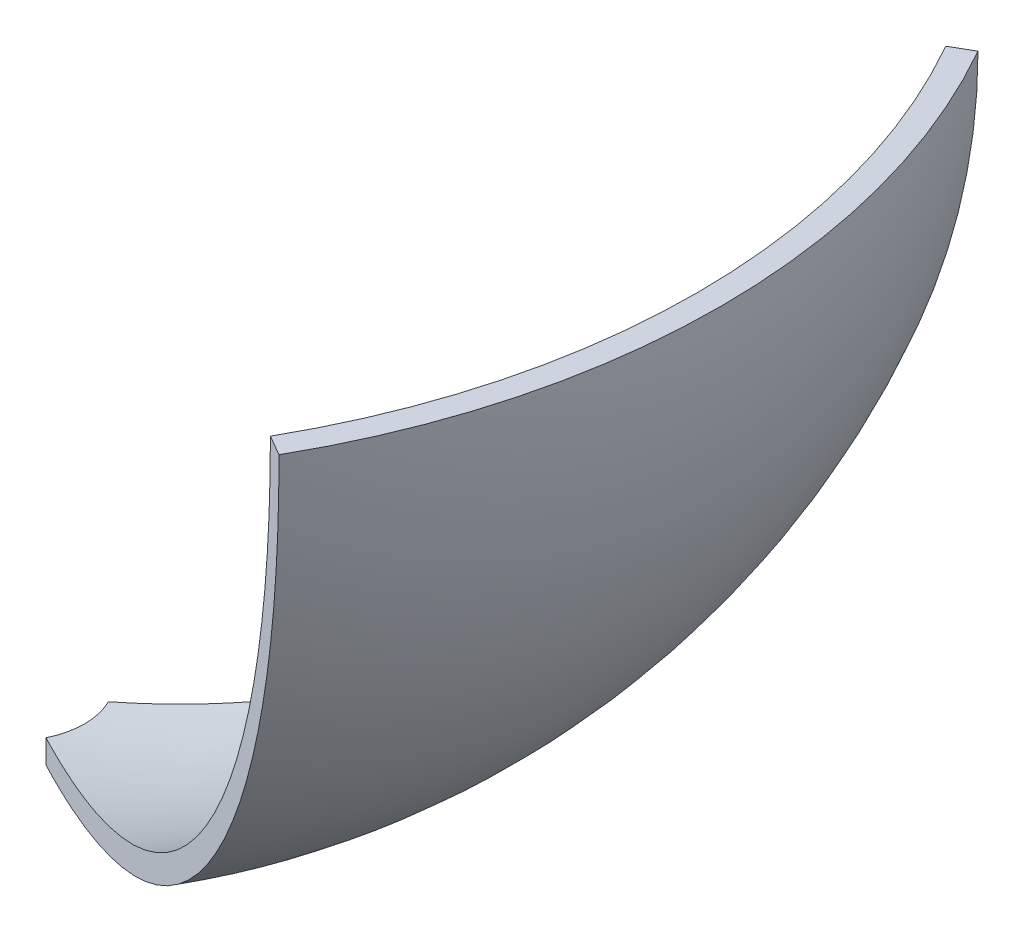
ISO-10303-21;
HEADER;
FILE_DESCRIPTION(('STEP AP214'),'2;1');
FILE_NAME('part.step','',(''),(''),'','','');
FILE_SCHEMA(('AUTOMOTIVE_DESIGN { 1 0 10303 214 1 1 1 1 }'));
ENDSEC;
DATA;
#1=APPLICATION_CONTEXT('core data for automotive mechanical design processes');
#2=APPLICATION_PROTOCOL_DEFINITION('international standard','automotive_design',2000,#1);
#3=PRODUCT_CONTEXT('',#1,'mechanical');
#4=PRODUCT('Part','Part','',(#3));
#5=PRODUCT_RELATED_PRODUCT_CATEGORY('part','',(#4));
#6=PRODUCT_DEFINITION_FORMATION('','',#4);
#7=PRODUCT_DEFINITION_CONTEXT('part definition',#1,'design');
#8=PRODUCT_DEFINITION('design','',#6,#7);
#9=PRODUCT_DEFINITION_SHAPE('','',#8);
#10=(LENGTH_UNIT() NAMED_UNIT(*) SI_UNIT(.MILLI.,.METRE.));
#11=(NAMED_UNIT(*) PLANE_ANGLE_UNIT() SI_UNIT($,.RADIAN.));
#12=(NAMED_UNIT(*) SI_UNIT($,.STERADIAN.) SOLID_ANGLE_UNIT());
#13=UNCERTAINTY_MEASURE_WITH_UNIT(LENGTH_MEASURE(1.E-05),#10,'distance_accuracy_value','');
#14=(GEOMETRIC_REPRESENTATION_CONTEXT(3) GLOBAL_UNCERTAINTY_ASSIGNED_CONTEXT((#13)) GLOBAL_UNIT_ASSIGNED_CONTEXT((#10,
#11,#12)) REPRESENTATION_CONTEXT('',''));
#15=CARTESIAN_POINT('',(0.,0.,0.));
#16=DIRECTION('',(0.,0.,1.));
#17=DIRECTION('',(1.,0.,0.));
#18=AXIS2_PLACEMENT_3D('',#15,#16,#17);
#19=CARTESIAN_POINT('',(0.,150.,0.));
#20=DIRECTION('',(0.,-1.,0.));
#21=DIRECTION('',(-0.866025403784438,0.,0.500000000000001));
#22=AXIS2_PLACEMENT_3D('',#19,#20,#21);
#23=SPHERICAL_SURFACE('',#22,150.);
#24=CARTESIAN_POINT('',(0.,150.,0.));
#25=DIRECTION('',(0.,-1.,0.));
#26=DIRECTION('',(1.,0.,0.));
#27=AXIS2_PLACEMENT_3D('',#24,#25,#26);
#28=CIRCLE('',#27,150.);
#29=CARTESIAN_POINT('',(130.400923784203,150.,-74.1323079111025));
#30=VERTEX_POINT('',#29);
#31=CARTESIAN_POINT('',(130.400923784244,150.,74.1323079110296));
#32=VERTEX_POINT('',#31);
#33=EDGE_CURVE('E187',#30,#32,#28,.T.);
#34=ORIENTED_EDGE('',*,*,#33,.T.);
#35=CARTESIAN_POINT('',(0.499999999999992,150.,-0.866025403784478));
#36=DIRECTION('',(-0.499999999999998,0.,0.86602540378444));
#37=DIRECTION('',(0.86602540378444,0.,0.499999999999998));
#38=AXIS2_PLACEMENT_3D('',#35,#36,#37);
#39=CIRCLE('',#38,149.996666629629);
#40=CARTESIAN_POINT('',(13.4614813968158,0.751884434007007,6.61728936976337));
#41=VERTEX_POINT('',#40);
#42=EDGE_CURVE('E200',#32,#41,#39,.F.);
#43=ORIENTED_EDGE('',*,*,#42,.T.);
#44=CARTESIAN_POINT('',(0.,0.751884434007033,0.));
#45=DIRECTION('',(0.,1.,0.));
#46=DIRECTION('',(0.,0.,1.));
#47=AXIS2_PLACEMENT_3D('',#44,#45,#46);
#48=CIRCLE('',#47,15.);
#49=CARTESIAN_POINT('',(13.461481396794,0.751884434007033,-6.6172893698077));
#50=VERTEX_POINT('',#49);
#51=EDGE_CURVE('E189',#41,#50,#48,.T.);
#52=ORIENTED_EDGE('',*,*,#51,.T.);
#53=CARTESIAN_POINT('',(0.499999999977488,150.,0.866025403744988));
#54=DIRECTION('',(-0.50000000000022,0.,-0.866025403784312));
#55=DIRECTION('',(-0.866025403784312,0.,0.50000000000022));
#56=AXIS2_PLACEMENT_3D('',#53,#54,#55);
#57=CIRCLE('',#56,149.996666629629);
#58=EDGE_CURVE('E157',#50,#30,#57,.F.);
#59=ORIENTED_EDGE('',*,*,#58,.T.);
#60=EDGE_LOOP('',(#34,#43,#52,#59));
#61=FACE_BOUND('',#60,.T.);
#62=ADVANCED_FACE('F135',(#61),#23,.T.);
#63=CARTESIAN_POINT('',(0.,150.,0.));
#64=DIRECTION('',(0.,-1.,0.));
#65=DIRECTION('',(0.866025403784438,0.,-0.500000000000001));
#66=AXIS2_PLACEMENT_3D('',#63,#64,#65);
#67=SPHERICAL_SURFACE('',#66,145.);
#68=CARTESIAN_POINT('',(0.,5.77794898144041,0.));
#69=DIRECTION('',(0.,1.,0.));
#70=DIRECTION('',(0.,0.,1.));
#71=AXIS2_PLACEMENT_3D('',#68,#69,#70);
#72=CIRCLE('',#71,15.);
#73=CARTESIAN_POINT('',(13.461481396794,5.77794898144041,-6.6172893698077));
#74=VERTEX_POINT('',#73);
#75=CARTESIAN_POINT('',(13.4614813968158,5.77794898144041,6.61728936976337));
#76=VERTEX_POINT('',#75);
#77=EDGE_CURVE('E197',#74,#76,#72,.F.);
#78=ORIENTED_EDGE('',*,*,#77,.T.);
#79=CARTESIAN_POINT('',(0.499999999999992,150.,-0.866025403784478));
#80=DIRECTION('',(-0.499999999999998,0.,0.86602540378444));
#81=DIRECTION('',(0.86602540378444,0.,0.499999999999998));
#82=AXIS2_PLACEMENT_3D('',#79,#80,#81);
#83=CIRCLE('',#82,144.996551683135);
#84=CARTESIAN_POINT('',(126.070697218738,150.,71.6322504377827));
#85=VERTEX_POINT('',#84);
#86=EDGE_CURVE('E150',#76,#85,#83,.T.);
#87=ORIENTED_EDGE('',*,*,#86,.T.);
#88=CARTESIAN_POINT('',(0.,150.,0.));
#89=DIRECTION('',(0.,-1.,0.));
#90=DIRECTION('',(1.,0.,0.));
#91=AXIS2_PLACEMENT_3D('',#88,#89,#90);
#92=CIRCLE('',#91,145.);
#93=CARTESIAN_POINT('',(126.070697218697,150.,-71.6322504378544));
#94=VERTEX_POINT('',#93);
#95=EDGE_CURVE('E192',#94,#85,#92,.T.);
#96=ORIENTED_EDGE('',*,*,#95,.F.);
#97=CARTESIAN_POINT('',(0.499999999977488,150.,0.866025403744988));
#98=DIRECTION('',(-0.50000000000022,0.,-0.866025403784312));
#99=DIRECTION('',(-0.866025403784312,0.,0.50000000000022));
#100=AXIS2_PLACEMENT_3D('',#97,#98,#99);
#101=CIRCLE('',#100,144.996551683135);
#102=EDGE_CURVE('E176',#94,#74,#101,.T.);
#103=ORIENTED_EDGE('',*,*,#102,.T.);
#104=EDGE_LOOP('',(#78,#87,#96,#103));
#105=FACE_BOUND('',#104,.T.);
#106=ADVANCED_FACE('F206',(#105),#67,.F.);
#107=CARTESIAN_POINT('',(125.573683548743,150.,-72.5000000000001));
#108=DIRECTION('',(0.,1.,0.));
#109=DIRECTION('',(-1.,0.,0.));
#110=AXIS2_PLACEMENT_3D('',#107,#108,#109);
#111=PLANE('',#110);
#112=ORIENTED_EDGE('',*,*,#95,.T.);
#113=DIRECTION('',(0.86602540378444,0.,0.499999999999998));
#114=VECTOR('',#113,1.);
#115=CARTESIAN_POINT('',(0.499999999999996,150.,-0.866025403784477));
#116=LINE('',#115,#114);
#117=EDGE_CURVE('E181',#85,#32,#116,.T.);
#118=ORIENTED_EDGE('',*,*,#117,.T.);
#119=ORIENTED_EDGE('',*,*,#33,.F.);
#120=DIRECTION('',(-0.866025403784312,0.,0.50000000000022));
#121=VECTOR('',#120,1.);
#122=CARTESIAN_POINT('',(154.533546158022,150.,-88.065283934887));
#123=LINE('',#122,#121);
#124=EDGE_CURVE('E173',#30,#94,#123,.T.);
#125=ORIENTED_EDGE('',*,*,#124,.T.);
#126=EDGE_LOOP('',(#112,#118,#119,#125));
#127=FACE_BOUND('',#126,.T.);
#128=ADVANCED_FACE('F137',(#127),#111,.T.);
#129=CARTESIAN_POINT('',(0.,9.,0.));
#130=DIRECTION('',(0.,-1.,0.));
#131=DIRECTION('',(0.,0.,-1.));
#132=AXIS2_PLACEMENT_3D('',#129,#130,#131);
#133=CYLINDRICAL_SURFACE('',#132,15.);
#134=ORIENTED_EDGE('',*,*,#51,.F.);
#135=DIRECTION('',(0.,-1.,0.));
#136=VECTOR('',#135,1.);
#137=CARTESIAN_POINT('',(13.4614813968158,9.,6.61728936976337));
#138=LINE('',#137,#136);
#139=EDGE_CURVE('E12',#41,#76,#138,.F.);
#140=ORIENTED_EDGE('',*,*,#139,.T.);
#141=ORIENTED_EDGE('',*,*,#77,.F.);
#142=DIRECTION('',(0.,-1.,0.));
#143=VECTOR('',#142,1.);
#144=CARTESIAN_POINT('',(13.461481396794,9.,-6.6172893698077));
#145=LINE('',#144,#143);
#146=EDGE_CURVE('E143',#74,#50,#145,.T.);
#147=ORIENTED_EDGE('',*,*,#146,.T.);
#148=EDGE_LOOP('',(#134,#140,#141,#147));
#149=FACE_BOUND('',#148,.T.);
#150=ADVANCED_FACE('F208',(#149),#133,.F.);
#151=CARTESIAN_POINT('',(154.533546158023,0.751884434007033,-88.065283934887));
#152=DIRECTION('',(-0.50000000000022,0.,-0.866025403784312));
#153=DIRECTION('',(-0.866025403784312,0.,0.50000000000022));
#154=AXIS2_PLACEMENT_3D('',#151,#152,#153);
#155=PLANE('',#154);
#156=ORIENTED_EDGE('',*,*,#146,.F.);
#157=ORIENTED_EDGE('',*,*,#102,.F.);
#158=ORIENTED_EDGE('',*,*,#124,.F.);
#159=ORIENTED_EDGE('',*,*,#58,.F.);
#160=EDGE_LOOP('',(#156,#157,#158,#159));
#161=FACE_BOUND('',#160,.T.);
#162=ADVANCED_FACE('F174',(#161),#155,.T.);
#163=CARTESIAN_POINT('',(0.500000000000023,0.751884434007005,-0.866025403784477));
#164=DIRECTION('',(-0.499999999999998,0.,0.86602540378444));
#165=DIRECTION('',(0.86602540378444,0.,0.499999999999998));
#166=AXIS2_PLACEMENT_3D('',#163,#164,#165);
#167=PLANE('',#166);
#168=ORIENTED_EDGE('',*,*,#117,.F.);
#169=ORIENTED_EDGE('',*,*,#86,.F.);
#170=ORIENTED_EDGE('',*,*,#139,.F.);
#171=ORIENTED_EDGE('',*,*,#42,.F.);
#172=EDGE_LOOP('',(#168,#169,#170,#171));
#173=FACE_BOUND('',#172,.T.);
#174=ADVANCED_FACE('F209',(#173),#167,.T.);
#175=CLOSED_SHELL('',(#62,#106,#128,#150,#162,#174));
#176=MANIFOLD_SOLID_BREP('B2',#175);
#177=ADVANCED_BREP_SHAPE_REPRESENTATION('',(#18,#176),#14);
#178=SHAPE_DEFINITION_REPRESENTATION(#9,#177);
ENDSEC;
END-ISO-10303-21;
